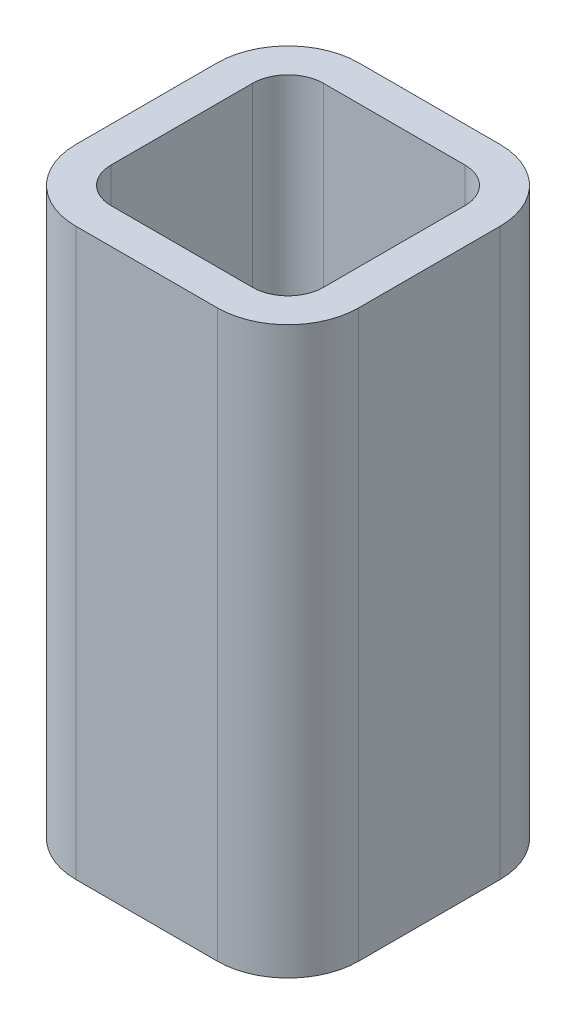
ISO-10303-21;
HEADER;
FILE_DESCRIPTION(('STEP AP214'),'2;1');
FILE_NAME('part.step','',(''),(''),'','','');
FILE_SCHEMA(('AUTOMOTIVE_DESIGN { 1 0 10303 214 1 1 1 1 }'));
ENDSEC;
DATA;
#1=APPLICATION_CONTEXT('core data for automotive mechanical design processes');
#2=APPLICATION_PROTOCOL_DEFINITION('international standard','automotive_design',2000,#1);
#3=PRODUCT_CONTEXT('',#1,'mechanical');
#4=PRODUCT('Part','Part','',(#3));
#5=PRODUCT_RELATED_PRODUCT_CATEGORY('part','',(#4));
#6=PRODUCT_DEFINITION_FORMATION('','',#4);
#7=PRODUCT_DEFINITION_CONTEXT('part definition',#1,'design');
#8=PRODUCT_DEFINITION('design','',#6,#7);
#9=PRODUCT_DEFINITION_SHAPE('','',#8);
#10=(LENGTH_UNIT() NAMED_UNIT(*) SI_UNIT(.MILLI.,.METRE.));
#11=(NAMED_UNIT(*) PLANE_ANGLE_UNIT() SI_UNIT($,.RADIAN.));
#12=(NAMED_UNIT(*) SI_UNIT($,.STERADIAN.) SOLID_ANGLE_UNIT());
#13=UNCERTAINTY_MEASURE_WITH_UNIT(LENGTH_MEASURE(1.E-05),#10,'distance_accuracy_value','');
#14=(GEOMETRIC_REPRESENTATION_CONTEXT(3) GLOBAL_UNCERTAINTY_ASSIGNED_CONTEXT((#13)) GLOBAL_UNIT_ASSIGNED_CONTEXT((#10,
#11,#12)) REPRESENTATION_CONTEXT('',''));
#15=CARTESIAN_POINT('',(0.,0.,0.));
#16=DIRECTION('',(0.,0.,1.));
#17=DIRECTION('',(1.,0.,0.));
#18=AXIS2_PLACEMENT_3D('',#15,#16,#17);
#19=CARTESIAN_POINT('',(-12.7,101.6,-38.1));
#20=DIRECTION('',(0.,-1.,0.));
#21=DIRECTION('',(0.,0.,-1.));
#22=AXIS2_PLACEMENT_3D('',#19,#20,#21);
#23=PLANE('',#22);
#24=CARTESIAN_POINT('',(-12.7,101.6,-38.1));
#25=DIRECTION('',(0.,1.,0.));
#26=DIRECTION('',(0.,0.,-1.));
#27=AXIS2_PLACEMENT_3D('',#24,#25,#26);
#28=CIRCLE('',#27,12.7);
#29=CARTESIAN_POINT('',(0.,101.6,-38.1));
#30=VERTEX_POINT('',#29);
#31=CARTESIAN_POINT('',(-12.7,101.6,-50.8));
#32=VERTEX_POINT('',#31);
#33=EDGE_CURVE('E248',#30,#32,#28,.T.);
#34=ORIENTED_EDGE('',*,*,#33,.T.);
#35=DIRECTION('',(-1.,0.,0.));
#36=VECTOR('',#35,1.);
#37=CARTESIAN_POINT('',(-38.1,101.6,-50.8));
#38=LINE('',#37,#36);
#39=CARTESIAN_POINT('',(-38.1,101.6,-50.8));
#40=VERTEX_POINT('',#39);
#41=EDGE_CURVE('E252',#32,#40,#38,.T.);
#42=ORIENTED_EDGE('',*,*,#41,.T.);
#43=CARTESIAN_POINT('',(-38.1,101.6,-38.1));
#44=DIRECTION('',(0.,1.,0.));
#45=DIRECTION('',(0.,0.,-1.));
#46=AXIS2_PLACEMENT_3D('',#43,#44,#45);
#47=CIRCLE('',#46,12.7);
#48=CARTESIAN_POINT('',(-50.8,101.6,-38.1));
#49=VERTEX_POINT('',#48);
#50=EDGE_CURVE('E256',#40,#49,#47,.T.);
#51=ORIENTED_EDGE('',*,*,#50,.T.);
#52=DIRECTION('',(0.,0.,1.));
#53=VECTOR('',#52,1.);
#54=CARTESIAN_POINT('',(-50.8,101.6,-12.7));
#55=LINE('',#54,#53);
#56=CARTESIAN_POINT('',(-50.8,101.6,-12.7));
#57=VERTEX_POINT('',#56);
#58=EDGE_CURVE('E259',#49,#57,#55,.T.);
#59=ORIENTED_EDGE('',*,*,#58,.T.);
#60=CARTESIAN_POINT('',(-38.1,101.6,-12.7));
#61=DIRECTION('',(0.,1.,0.));
#62=DIRECTION('',(0.,0.,-1.));
#63=AXIS2_PLACEMENT_3D('',#60,#61,#62);
#64=CIRCLE('',#63,12.7);
#65=CARTESIAN_POINT('',(-38.1,101.6,0.));
#66=VERTEX_POINT('',#65);
#67=EDGE_CURVE('E262',#57,#66,#64,.T.);
#68=ORIENTED_EDGE('',*,*,#67,.T.);
#69=DIRECTION('',(1.,0.,0.));
#70=VECTOR('',#69,1.);
#71=CARTESIAN_POINT('',(-12.7000000000001,101.6,0.));
#72=LINE('',#71,#70);
#73=CARTESIAN_POINT('',(-12.7000000000001,101.6,0.));
#74=VERTEX_POINT('',#73);
#75=EDGE_CURVE('E265',#66,#74,#72,.T.);
#76=ORIENTED_EDGE('',*,*,#75,.T.);
#77=CARTESIAN_POINT('',(-12.7,101.6,-12.7));
#78=DIRECTION('',(0.,1.,0.));
#79=DIRECTION('',(0.,0.,-1.));
#80=AXIS2_PLACEMENT_3D('',#77,#78,#79);
#81=CIRCLE('',#80,12.7);
#82=CARTESIAN_POINT('',(0.,101.6,-12.7000000000001));
#83=VERTEX_POINT('',#82);
#84=EDGE_CURVE('E268',#74,#83,#81,.T.);
#85=ORIENTED_EDGE('',*,*,#84,.T.);
#86=DIRECTION('',(0.,0.,-1.));
#87=VECTOR('',#86,1.);
#88=CARTESIAN_POINT('',(0.,101.6,-38.1));
#89=LINE('',#88,#87);
#90=EDGE_CURVE('E271',#83,#30,#89,.T.);
#91=ORIENTED_EDGE('',*,*,#90,.T.);
#92=EDGE_LOOP('',(#34,#42,#51,#59,#68,#76,#85,#91));
#93=FACE_BOUND('',#92,.T.);
#94=CARTESIAN_POINT('',(-12.7,101.6,-12.7));
#95=DIRECTION('',(0.,1.,0.));
#96=DIRECTION('',(0.,0.,-1.));
#97=AXIS2_PLACEMENT_3D('',#94,#95,#96);
#98=CIRCLE('',#97,6.35);
#99=CARTESIAN_POINT('',(-12.7000000000001,101.6,-6.35));
#100=VERTEX_POINT('',#99);
#101=CARTESIAN_POINT('',(-6.35,101.6,-12.7000000000001));
#102=VERTEX_POINT('',#101);
#103=EDGE_CURVE('E159',#100,#102,#98,.T.);
#104=ORIENTED_EDGE('',*,*,#103,.F.);
#105=DIRECTION('',(1.,0.,0.));
#106=VECTOR('',#105,1.);
#107=CARTESIAN_POINT('',(-12.7000000000001,101.6,-6.35));
#108=LINE('',#107,#106);
#109=CARTESIAN_POINT('',(-38.1,101.6,-6.35));
#110=VERTEX_POINT('',#109);
#111=EDGE_CURVE('E200',#110,#100,#108,.T.);
#112=ORIENTED_EDGE('',*,*,#111,.F.);
#113=CARTESIAN_POINT('',(-38.1,101.6,-12.7));
#114=DIRECTION('',(0.,1.,0.));
#115=DIRECTION('',(0.,0.,-1.));
#116=AXIS2_PLACEMENT_3D('',#113,#114,#115);
#117=CIRCLE('',#116,6.35);
#118=CARTESIAN_POINT('',(-44.45,101.6,-12.7));
#119=VERTEX_POINT('',#118);
#120=EDGE_CURVE('E197',#119,#110,#117,.T.);
#121=ORIENTED_EDGE('',*,*,#120,.F.);
#122=DIRECTION('',(0.,0.,1.));
#123=VECTOR('',#122,1.);
#124=CARTESIAN_POINT('',(-44.45,101.6,-12.7));
#125=LINE('',#124,#123);
#126=CARTESIAN_POINT('',(-44.45,101.6,-38.1));
#127=VERTEX_POINT('',#126);
#128=EDGE_CURVE('E194',#127,#119,#125,.T.);
#129=ORIENTED_EDGE('',*,*,#128,.F.);
#130=CARTESIAN_POINT('',(-38.1,101.6,-38.1));
#131=DIRECTION('',(0.,1.,0.));
#132=DIRECTION('',(0.,0.,-1.));
#133=AXIS2_PLACEMENT_3D('',#130,#131,#132);
#134=CIRCLE('',#133,6.35);
#135=CARTESIAN_POINT('',(-38.1,101.6,-44.45));
#136=VERTEX_POINT('',#135);
#137=EDGE_CURVE('E191',#136,#127,#134,.T.);
#138=ORIENTED_EDGE('',*,*,#137,.F.);
#139=DIRECTION('',(-1.,0.,0.));
#140=VECTOR('',#139,1.);
#141=CARTESIAN_POINT('',(-38.1,101.6,-44.45));
#142=LINE('',#141,#140);
#143=CARTESIAN_POINT('',(-12.7,101.6,-44.45));
#144=VERTEX_POINT('',#143);
#145=EDGE_CURVE('E186',#144,#136,#142,.T.);
#146=ORIENTED_EDGE('',*,*,#145,.F.);
#147=CARTESIAN_POINT('',(-12.7,101.6,-38.1));
#148=DIRECTION('',(0.,1.,0.));
#149=DIRECTION('',(0.,0.,-1.));
#150=AXIS2_PLACEMENT_3D('',#147,#148,#149);
#151=CIRCLE('',#150,6.35);
#152=CARTESIAN_POINT('',(-6.35000000000001,101.6,-38.1));
#153=VERTEX_POINT('',#152);
#154=EDGE_CURVE('E182',#153,#144,#151,.T.);
#155=ORIENTED_EDGE('',*,*,#154,.F.);
#156=DIRECTION('',(0.,0.,-1.));
#157=VECTOR('',#156,1.);
#158=CARTESIAN_POINT('',(-6.35,101.6,-38.1));
#159=LINE('',#158,#157);
#160=EDGE_CURVE('E168',#102,#153,#159,.T.);
#161=ORIENTED_EDGE('',*,*,#160,.F.);
#162=EDGE_LOOP('',(#104,#112,#121,#129,#138,#146,#155,#161));
#163=FACE_BOUND('',#162,.T.);
#164=ADVANCED_FACE('F45',(#93,#163),#23,.F.);
#165=CARTESIAN_POINT('',(-12.7,0.,-38.1));
#166=DIRECTION('',(0.,-1.,0.));
#167=DIRECTION('',(0.,0.,-1.));
#168=AXIS2_PLACEMENT_3D('',#165,#166,#167);
#169=PLANE('',#168);
#170=CARTESIAN_POINT('',(-12.7,0.,-38.1));
#171=DIRECTION('',(0.,1.,0.));
#172=DIRECTION('',(0.,0.,-1.));
#173=AXIS2_PLACEMENT_3D('',#170,#171,#172);
#174=CIRCLE('',#173,12.7);
#175=CARTESIAN_POINT('',(0.,0.,-38.1));
#176=VERTEX_POINT('',#175);
#177=CARTESIAN_POINT('',(-12.7,0.,-50.8));
#178=VERTEX_POINT('',#177);
#179=EDGE_CURVE('E177',#176,#178,#174,.T.);
#180=ORIENTED_EDGE('',*,*,#179,.F.);
#181=DIRECTION('',(0.,0.,-1.));
#182=VECTOR('',#181,1.);
#183=CARTESIAN_POINT('',(0.,0.,-38.1));
#184=LINE('',#183,#182);
#185=CARTESIAN_POINT('',(0.,0.,-12.7000000000001));
#186=VERTEX_POINT('',#185);
#187=EDGE_CURVE('E253',#186,#176,#184,.T.);
#188=ORIENTED_EDGE('',*,*,#187,.F.);
#189=CARTESIAN_POINT('',(-12.7,0.,-12.7));
#190=DIRECTION('',(0.,1.,0.));
#191=DIRECTION('',(0.,0.,-1.));
#192=AXIS2_PLACEMENT_3D('',#189,#190,#191);
#193=CIRCLE('',#192,12.7);
#194=CARTESIAN_POINT('',(-12.7000000000001,0.,0.));
#195=VERTEX_POINT('',#194);
#196=EDGE_CURVE('E293',#195,#186,#193,.T.);
#197=ORIENTED_EDGE('',*,*,#196,.F.);
#198=DIRECTION('',(1.,0.,0.));
#199=VECTOR('',#198,1.);
#200=CARTESIAN_POINT('',(-12.7000000000001,0.,0.));
#201=LINE('',#200,#199);
#202=CARTESIAN_POINT('',(-38.1,0.,0.));
#203=VERTEX_POINT('',#202);
#204=EDGE_CURVE('E290',#203,#195,#201,.T.);
#205=ORIENTED_EDGE('',*,*,#204,.F.);
#206=CARTESIAN_POINT('',(-38.1,0.,-12.7));
#207=DIRECTION('',(0.,1.,0.));
#208=DIRECTION('',(0.,0.,-1.));
#209=AXIS2_PLACEMENT_3D('',#206,#207,#208);
#210=CIRCLE('',#209,12.7);
#211=CARTESIAN_POINT('',(-50.8,0.,-12.7));
#212=VERTEX_POINT('',#211);
#213=EDGE_CURVE('E287',#212,#203,#210,.T.);
#214=ORIENTED_EDGE('',*,*,#213,.F.);
#215=DIRECTION('',(0.,0.,1.));
#216=VECTOR('',#215,1.);
#217=CARTESIAN_POINT('',(-50.8,0.,-12.7));
#218=LINE('',#217,#216);
#219=CARTESIAN_POINT('',(-50.8,0.,-38.1));
#220=VERTEX_POINT('',#219);
#221=EDGE_CURVE('E284',#220,#212,#218,.T.);
#222=ORIENTED_EDGE('',*,*,#221,.F.);
#223=CARTESIAN_POINT('',(-38.1,0.,-38.1));
#224=DIRECTION('',(0.,1.,0.));
#225=DIRECTION('',(0.,0.,-1.));
#226=AXIS2_PLACEMENT_3D('',#223,#224,#225);
#227=CIRCLE('',#226,12.7);
#228=CARTESIAN_POINT('',(-38.1,0.,-50.8));
#229=VERTEX_POINT('',#228);
#230=EDGE_CURVE('E281',#229,#220,#227,.T.);
#231=ORIENTED_EDGE('',*,*,#230,.F.);
#232=DIRECTION('',(-1.,0.,0.));
#233=VECTOR('',#232,1.);
#234=CARTESIAN_POINT('',(-38.1,0.,-50.8));
#235=LINE('',#234,#233);
#236=EDGE_CURVE('E278',#178,#229,#235,.T.);
#237=ORIENTED_EDGE('',*,*,#236,.F.);
#238=EDGE_LOOP('',(#180,#188,#197,#205,#214,#222,#231,#237));
#239=FACE_BOUND('',#238,.T.);
#240=DIRECTION('',(1.,0.,0.));
#241=VECTOR('',#240,1.);
#242=CARTESIAN_POINT('',(-12.7000000000001,0.,-6.35));
#243=LINE('',#242,#241);
#244=CARTESIAN_POINT('',(-38.1,0.,-6.35));
#245=VERTEX_POINT('',#244);
#246=CARTESIAN_POINT('',(-12.7000000000001,0.,-6.35));
#247=VERTEX_POINT('',#246);
#248=EDGE_CURVE('E169',#245,#247,#243,.T.);
#249=ORIENTED_EDGE('',*,*,#248,.T.);
#250=CARTESIAN_POINT('',(-12.7,0.,-12.7));
#251=DIRECTION('',(0.,1.,0.));
#252=DIRECTION('',(0.,0.,-1.));
#253=AXIS2_PLACEMENT_3D('',#250,#251,#252);
#254=CIRCLE('',#253,6.35);
#255=CARTESIAN_POINT('',(-6.35,0.,-12.7000000000001));
#256=VERTEX_POINT('',#255);
#257=EDGE_CURVE('E69',#247,#256,#254,.T.);
#258=ORIENTED_EDGE('',*,*,#257,.T.);
#259=DIRECTION('',(0.,0.,-1.));
#260=VECTOR('',#259,1.);
#261=CARTESIAN_POINT('',(-6.35,0.,-38.1));
#262=LINE('',#261,#260);
#263=CARTESIAN_POINT('',(-6.35000000000001,0.,-38.1));
#264=VERTEX_POINT('',#263);
#265=EDGE_CURVE('E175',#256,#264,#262,.T.);
#266=ORIENTED_EDGE('',*,*,#265,.T.);
#267=CARTESIAN_POINT('',(-12.7,0.,-38.1));
#268=DIRECTION('',(0.,1.,0.));
#269=DIRECTION('',(0.,0.,-1.));
#270=AXIS2_PLACEMENT_3D('',#267,#268,#269);
#271=CIRCLE('',#270,6.35);
#272=CARTESIAN_POINT('',(-12.7,0.,-44.45));
#273=VERTEX_POINT('',#272);
#274=EDGE_CURVE('E207',#264,#273,#271,.T.);
#275=ORIENTED_EDGE('',*,*,#274,.T.);
#276=DIRECTION('',(-1.,0.,0.));
#277=VECTOR('',#276,1.);
#278=CARTESIAN_POINT('',(-38.1,0.,-44.45));
#279=LINE('',#278,#277);
#280=CARTESIAN_POINT('',(-38.1,0.,-44.45));
#281=VERTEX_POINT('',#280);
#282=EDGE_CURVE('E211',#273,#281,#279,.T.);
#283=ORIENTED_EDGE('',*,*,#282,.T.);
#284=CARTESIAN_POINT('',(-38.1,0.,-38.1));
#285=DIRECTION('',(0.,1.,0.));
#286=DIRECTION('',(0.,0.,-1.));
#287=AXIS2_PLACEMENT_3D('',#284,#285,#286);
#288=CIRCLE('',#287,6.35);
#289=CARTESIAN_POINT('',(-44.45,0.,-38.1));
#290=VERTEX_POINT('',#289);
#291=EDGE_CURVE('E215',#281,#290,#288,.T.);
#292=ORIENTED_EDGE('',*,*,#291,.T.);
#293=DIRECTION('',(0.,0.,1.));
#294=VECTOR('',#293,1.);
#295=CARTESIAN_POINT('',(-44.45,0.,-12.7));
#296=LINE('',#295,#294);
#297=CARTESIAN_POINT('',(-44.45,0.,-12.7));
#298=VERTEX_POINT('',#297);
#299=EDGE_CURVE('E219',#290,#298,#296,.T.);
#300=ORIENTED_EDGE('',*,*,#299,.T.);
#301=CARTESIAN_POINT('',(-38.1,0.,-12.7));
#302=DIRECTION('',(0.,1.,0.));
#303=DIRECTION('',(0.,0.,-1.));
#304=AXIS2_PLACEMENT_3D('',#301,#302,#303);
#305=CIRCLE('',#304,6.35);
#306=EDGE_CURVE('E223',#298,#245,#305,.T.);
#307=ORIENTED_EDGE('',*,*,#306,.T.);
#308=EDGE_LOOP('',(#249,#258,#266,#275,#283,#292,#300,#307));
#309=FACE_BOUND('',#308,.T.);
#310=ADVANCED_FACE('F332',(#239,#309),#169,.T.);
#311=CARTESIAN_POINT('',(-12.7,101.6,-38.1));
#312=DIRECTION('',(0.,-1.,0.));
#313=DIRECTION('',(0.,0.,-1.));
#314=AXIS2_PLACEMENT_3D('',#311,#312,#313);
#315=CYLINDRICAL_SURFACE('',#314,12.7);
#316=ORIENTED_EDGE('',*,*,#179,.T.);
#317=DIRECTION('',(0.,-1.,0.));
#318=VECTOR('',#317,1.);
#319=CARTESIAN_POINT('',(-12.7,101.6,-50.8));
#320=LINE('',#319,#318);
#321=EDGE_CURVE('E11',#32,#178,#320,.T.);
#322=ORIENTED_EDGE('',*,*,#321,.F.);
#323=ORIENTED_EDGE('',*,*,#33,.F.);
#324=DIRECTION('',(0.,-1.,0.));
#325=VECTOR('',#324,1.);
#326=CARTESIAN_POINT('',(0.,101.6,-38.1));
#327=LINE('',#326,#325);
#328=EDGE_CURVE('E274',#30,#176,#327,.T.);
#329=ORIENTED_EDGE('',*,*,#328,.T.);
#330=EDGE_LOOP('',(#316,#322,#323,#329));
#331=FACE_BOUND('',#330,.T.);
#332=ADVANCED_FACE('F47',(#331),#315,.T.);
#333=CARTESIAN_POINT('',(-38.1,101.6,-50.8));
#334=DIRECTION('',(0.,0.,1.));
#335=DIRECTION('',(1.,0.,0.));
#336=AXIS2_PLACEMENT_3D('',#333,#334,#335);
#337=PLANE('',#336);
#338=ORIENTED_EDGE('',*,*,#236,.T.);
#339=DIRECTION('',(0.,-1.,0.));
#340=VECTOR('',#339,1.);
#341=CARTESIAN_POINT('',(-38.1,101.6,-50.8));
#342=LINE('',#341,#340);
#343=EDGE_CURVE('E54',#40,#229,#342,.T.);
#344=ORIENTED_EDGE('',*,*,#343,.F.);
#345=ORIENTED_EDGE('',*,*,#41,.F.);
#346=ORIENTED_EDGE('',*,*,#321,.T.);
#347=EDGE_LOOP('',(#338,#344,#345,#346));
#348=FACE_BOUND('',#347,.T.);
#349=ADVANCED_FACE('F349',(#348),#337,.F.);
#350=CARTESIAN_POINT('',(-38.1,101.6,-38.1));
#351=DIRECTION('',(0.,-1.,0.));
#352=DIRECTION('',(0.,0.,-1.));
#353=AXIS2_PLACEMENT_3D('',#350,#351,#352);
#354=CYLINDRICAL_SURFACE('',#353,12.7);
#355=ORIENTED_EDGE('',*,*,#230,.T.);
#356=DIRECTION('',(0.,-1.,0.));
#357=VECTOR('',#356,1.);
#358=CARTESIAN_POINT('',(-50.8,101.6,-38.1));
#359=LINE('',#358,#357);
#360=EDGE_CURVE('E317',#49,#220,#359,.T.);
#361=ORIENTED_EDGE('',*,*,#360,.F.);
#362=ORIENTED_EDGE('',*,*,#50,.F.);
#363=ORIENTED_EDGE('',*,*,#343,.T.);
#364=EDGE_LOOP('',(#355,#361,#362,#363));
#365=FACE_BOUND('',#364,.T.);
#366=ADVANCED_FACE('F326',(#365),#354,.T.);
#367=CARTESIAN_POINT('',(-50.8,101.6,-12.7));
#368=DIRECTION('',(1.,0.,0.));
#369=DIRECTION('',(0.,0.,-1.));
#370=AXIS2_PLACEMENT_3D('',#367,#368,#369);
#371=PLANE('',#370);
#372=ORIENTED_EDGE('',*,*,#221,.T.);
#373=DIRECTION('',(0.,-1.,0.));
#374=VECTOR('',#373,1.);
#375=CARTESIAN_POINT('',(-50.8,101.6,-12.7));
#376=LINE('',#375,#374);
#377=EDGE_CURVE('E313',#57,#212,#376,.T.);
#378=ORIENTED_EDGE('',*,*,#377,.F.);
#379=ORIENTED_EDGE('',*,*,#58,.F.);
#380=ORIENTED_EDGE('',*,*,#360,.T.);
#381=EDGE_LOOP('',(#372,#378,#379,#380));
#382=FACE_BOUND('',#381,.T.);
#383=ADVANCED_FACE('F338',(#382),#371,.F.);
#384=CARTESIAN_POINT('',(-38.1,101.6,-12.7));
#385=DIRECTION('',(0.,-1.,0.));
#386=DIRECTION('',(0.,0.,-1.));
#387=AXIS2_PLACEMENT_3D('',#384,#385,#386);
#388=CYLINDRICAL_SURFACE('',#387,12.7);
#389=ORIENTED_EDGE('',*,*,#213,.T.);
#390=DIRECTION('',(0.,-1.,0.));
#391=VECTOR('',#390,1.);
#392=CARTESIAN_POINT('',(-38.1,101.6,0.));
#393=LINE('',#392,#391);
#394=EDGE_CURVE('E309',#66,#203,#393,.T.);
#395=ORIENTED_EDGE('',*,*,#394,.F.);
#396=ORIENTED_EDGE('',*,*,#67,.F.);
#397=ORIENTED_EDGE('',*,*,#377,.T.);
#398=EDGE_LOOP('',(#389,#395,#396,#397));
#399=FACE_BOUND('',#398,.T.);
#400=ADVANCED_FACE('F342',(#399),#388,.T.);
#401=CARTESIAN_POINT('',(-12.7000000000001,101.6,0.));
#402=DIRECTION('',(0.,0.,-1.));
#403=DIRECTION('',(-1.,0.,0.));
#404=AXIS2_PLACEMENT_3D('',#401,#402,#403);
#405=PLANE('',#404);
#406=ORIENTED_EDGE('',*,*,#204,.T.);
#407=DIRECTION('',(0.,-1.,0.));
#408=VECTOR('',#407,1.);
#409=CARTESIAN_POINT('',(-12.7000000000001,101.6,0.));
#410=LINE('',#409,#408);
#411=EDGE_CURVE('E305',#74,#195,#410,.T.);
#412=ORIENTED_EDGE('',*,*,#411,.F.);
#413=ORIENTED_EDGE('',*,*,#75,.F.);
#414=ORIENTED_EDGE('',*,*,#394,.T.);
#415=EDGE_LOOP('',(#406,#412,#413,#414));
#416=FACE_BOUND('',#415,.T.);
#417=ADVANCED_FACE('F362',(#416),#405,.F.);
#418=CARTESIAN_POINT('',(-12.7,101.6,-12.7));
#419=DIRECTION('',(0.,-1.,0.));
#420=DIRECTION('',(0.,0.,-1.));
#421=AXIS2_PLACEMENT_3D('',#418,#419,#420);
#422=CYLINDRICAL_SURFACE('',#421,12.7);
#423=ORIENTED_EDGE('',*,*,#196,.T.);
#424=DIRECTION('',(0.,-1.,0.));
#425=VECTOR('',#424,1.);
#426=CARTESIAN_POINT('',(0.,101.6,-12.7000000000001));
#427=LINE('',#426,#425);
#428=EDGE_CURVE('E301',#83,#186,#427,.T.);
#429=ORIENTED_EDGE('',*,*,#428,.F.);
#430=ORIENTED_EDGE('',*,*,#84,.F.);
#431=ORIENTED_EDGE('',*,*,#411,.T.);
#432=EDGE_LOOP('',(#423,#429,#430,#431));
#433=FACE_BOUND('',#432,.T.);
#434=ADVANCED_FACE('F360',(#433),#422,.T.);
#435=CARTESIAN_POINT('',(0.,101.6,-38.1));
#436=DIRECTION('',(-1.,0.,0.));
#437=DIRECTION('',(0.,0.,1.));
#438=AXIS2_PLACEMENT_3D('',#435,#436,#437);
#439=PLANE('',#438);
#440=ORIENTED_EDGE('',*,*,#187,.T.);
#441=ORIENTED_EDGE('',*,*,#328,.F.);
#442=ORIENTED_EDGE('',*,*,#90,.F.);
#443=ORIENTED_EDGE('',*,*,#428,.T.);
#444=EDGE_LOOP('',(#440,#441,#442,#443));
#445=FACE_BOUND('',#444,.T.);
#446=ADVANCED_FACE('F355',(#445),#439,.F.);
#447=CARTESIAN_POINT('',(-12.7,101.6,-12.7));
#448=DIRECTION('',(0.,-1.,0.));
#449=DIRECTION('',(0.,0.,-1.));
#450=AXIS2_PLACEMENT_3D('',#447,#448,#449);
#451=CYLINDRICAL_SURFACE('',#450,6.35);
#452=ORIENTED_EDGE('',*,*,#257,.F.);
#453=DIRECTION('',(0.,-1.,0.));
#454=VECTOR('',#453,1.);
#455=CARTESIAN_POINT('',(-12.7000000000001,101.6,-6.35));
#456=LINE('',#455,#454);
#457=EDGE_CURVE('E163',#100,#247,#456,.T.);
#458=ORIENTED_EDGE('',*,*,#457,.F.);
#459=ORIENTED_EDGE('',*,*,#103,.T.);
#460=DIRECTION('',(0.,-1.,0.));
#461=VECTOR('',#460,1.);
#462=CARTESIAN_POINT('',(-6.35,101.6,-12.7000000000001));
#463=LINE('',#462,#461);
#464=EDGE_CURVE('E162',#102,#256,#463,.T.);
#465=ORIENTED_EDGE('',*,*,#464,.T.);
#466=EDGE_LOOP('',(#452,#458,#459,#465));
#467=FACE_BOUND('',#466,.T.);
#468=ADVANCED_FACE('F161',(#467),#451,.F.);
#469=CARTESIAN_POINT('',(-6.35,101.6,-38.1));
#470=DIRECTION('',(-1.,0.,0.));
#471=DIRECTION('',(0.,0.,1.));
#472=AXIS2_PLACEMENT_3D('',#469,#470,#471);
#473=PLANE('',#472);
#474=ORIENTED_EDGE('',*,*,#265,.F.);
#475=ORIENTED_EDGE('',*,*,#464,.F.);
#476=ORIENTED_EDGE('',*,*,#160,.T.);
#477=DIRECTION('',(0.,-1.,0.));
#478=VECTOR('',#477,1.);
#479=CARTESIAN_POINT('',(-6.35000000000001,101.6,-38.1));
#480=LINE('',#479,#478);
#481=EDGE_CURVE('E178',#153,#264,#480,.T.);
#482=ORIENTED_EDGE('',*,*,#481,.T.);
#483=EDGE_LOOP('',(#474,#475,#476,#482));
#484=FACE_BOUND('',#483,.T.);
#485=ADVANCED_FACE('F172',(#484),#473,.T.);
#486=CARTESIAN_POINT('',(-12.7,101.6,-38.1));
#487=DIRECTION('',(0.,-1.,0.));
#488=DIRECTION('',(0.,0.,-1.));
#489=AXIS2_PLACEMENT_3D('',#486,#487,#488);
#490=CYLINDRICAL_SURFACE('',#489,6.35);
#491=ORIENTED_EDGE('',*,*,#274,.F.);
#492=ORIENTED_EDGE('',*,*,#481,.F.);
#493=ORIENTED_EDGE('',*,*,#154,.T.);
#494=DIRECTION('',(0.,-1.,0.));
#495=VECTOR('',#494,1.);
#496=CARTESIAN_POINT('',(-12.7,101.6,-44.45));
#497=LINE('',#496,#495);
#498=EDGE_CURVE('E243',#144,#273,#497,.T.);
#499=ORIENTED_EDGE('',*,*,#498,.T.);
#500=EDGE_LOOP('',(#491,#492,#493,#499));
#501=FACE_BOUND('',#500,.T.);
#502=ADVANCED_FACE('F387',(#501),#490,.F.);
#503=CARTESIAN_POINT('',(-38.1,101.6,-44.45));
#504=DIRECTION('',(0.,0.,1.));
#505=DIRECTION('',(1.,0.,0.));
#506=AXIS2_PLACEMENT_3D('',#503,#504,#505);
#507=PLANE('',#506);
#508=ORIENTED_EDGE('',*,*,#282,.F.);
#509=ORIENTED_EDGE('',*,*,#498,.F.);
#510=ORIENTED_EDGE('',*,*,#145,.T.);
#511=DIRECTION('',(0.,-1.,0.));
#512=VECTOR('',#511,1.);
#513=CARTESIAN_POINT('',(-38.1,101.6,-44.45));
#514=LINE('',#513,#512);
#515=EDGE_CURVE('E240',#136,#281,#514,.T.);
#516=ORIENTED_EDGE('',*,*,#515,.T.);
#517=EDGE_LOOP('',(#508,#509,#510,#516));
#518=FACE_BOUND('',#517,.T.);
#519=ADVANCED_FACE('F391',(#518),#507,.T.);
#520=CARTESIAN_POINT('',(-38.1,101.6,-38.1));
#521=DIRECTION('',(0.,-1.,0.));
#522=DIRECTION('',(0.,0.,-1.));
#523=AXIS2_PLACEMENT_3D('',#520,#521,#522);
#524=CYLINDRICAL_SURFACE('',#523,6.35);
#525=ORIENTED_EDGE('',*,*,#291,.F.);
#526=ORIENTED_EDGE('',*,*,#515,.F.);
#527=ORIENTED_EDGE('',*,*,#137,.T.);
#528=DIRECTION('',(0.,-1.,0.));
#529=VECTOR('',#528,1.);
#530=CARTESIAN_POINT('',(-44.45,101.6,-38.1));
#531=LINE('',#530,#529);
#532=EDGE_CURVE('E237',#127,#290,#531,.T.);
#533=ORIENTED_EDGE('',*,*,#532,.T.);
#534=EDGE_LOOP('',(#525,#526,#527,#533));
#535=FACE_BOUND('',#534,.T.);
#536=ADVANCED_FACE('F397',(#535),#524,.F.);
#537=CARTESIAN_POINT('',(-44.45,101.6,-12.7));
#538=DIRECTION('',(1.,0.,0.));
#539=DIRECTION('',(0.,0.,-1.));
#540=AXIS2_PLACEMENT_3D('',#537,#538,#539);
#541=PLANE('',#540);
#542=ORIENTED_EDGE('',*,*,#299,.F.);
#543=ORIENTED_EDGE('',*,*,#532,.F.);
#544=ORIENTED_EDGE('',*,*,#128,.T.);
#545=DIRECTION('',(0.,-1.,0.));
#546=VECTOR('',#545,1.);
#547=CARTESIAN_POINT('',(-44.45,101.6,-12.7));
#548=LINE('',#547,#546);
#549=EDGE_CURVE('E234',#119,#298,#548,.T.);
#550=ORIENTED_EDGE('',*,*,#549,.T.);
#551=EDGE_LOOP('',(#542,#543,#544,#550));
#552=FACE_BOUND('',#551,.T.);
#553=ADVANCED_FACE('F401',(#552),#541,.T.);
#554=CARTESIAN_POINT('',(-38.1,101.6,-12.7));
#555=DIRECTION('',(0.,-1.,0.));
#556=DIRECTION('',(0.,0.,-1.));
#557=AXIS2_PLACEMENT_3D('',#554,#555,#556);
#558=CYLINDRICAL_SURFACE('',#557,6.35);
#559=ORIENTED_EDGE('',*,*,#306,.F.);
#560=ORIENTED_EDGE('',*,*,#549,.F.);
#561=ORIENTED_EDGE('',*,*,#120,.T.);
#562=DIRECTION('',(0.,-1.,0.));
#563=VECTOR('',#562,1.);
#564=CARTESIAN_POINT('',(-38.1,101.6,-6.35));
#565=LINE('',#564,#563);
#566=EDGE_CURVE('E61',#110,#245,#565,.T.);
#567=ORIENTED_EDGE('',*,*,#566,.T.);
#568=EDGE_LOOP('',(#559,#560,#561,#567));
#569=FACE_BOUND('',#568,.T.);
#570=ADVANCED_FACE('F405',(#569),#558,.F.);
#571=CARTESIAN_POINT('',(-12.7000000000001,101.6,-6.35));
#572=DIRECTION('',(0.,0.,-1.));
#573=DIRECTION('',(-1.,0.,0.));
#574=AXIS2_PLACEMENT_3D('',#571,#572,#573);
#575=PLANE('',#574);
#576=ORIENTED_EDGE('',*,*,#248,.F.);
#577=ORIENTED_EDGE('',*,*,#566,.F.);
#578=ORIENTED_EDGE('',*,*,#111,.T.);
#579=ORIENTED_EDGE('',*,*,#457,.T.);
#580=EDGE_LOOP('',(#576,#577,#578,#579));
#581=FACE_BOUND('',#580,.T.);
#582=ADVANCED_FACE('F409',(#581),#575,.T.);
#583=CLOSED_SHELL('',(#164,#310,#332,#349,#366,#383,#400,#417,#434,#446,#468,#485,#502,#519,
#536,#553,#570,#582));
#584=MANIFOLD_SOLID_BREP('B2',#583);
#585=ADVANCED_BREP_SHAPE_REPRESENTATION('',(#18,#584),#14);
#586=SHAPE_DEFINITION_REPRESENTATION(#9,#585);
ENDSEC;
END-ISO-10303-21;
